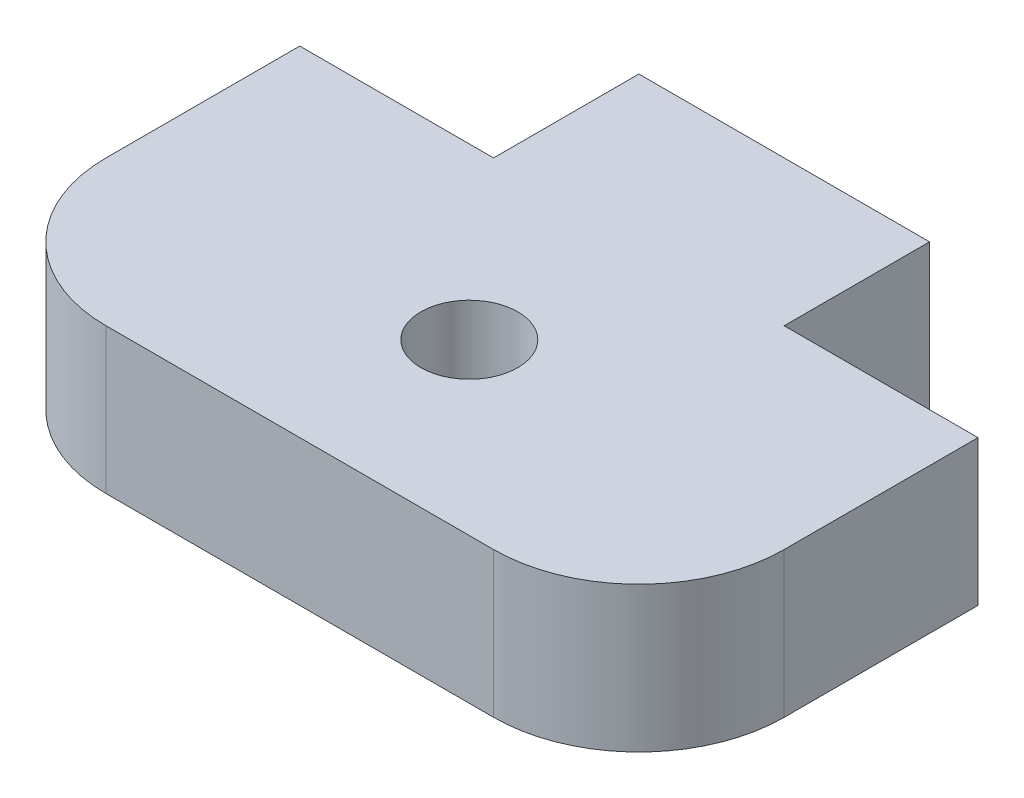
ISO-10303-21;
HEADER;
FILE_DESCRIPTION(('STEP AP214'),'2;1');
FILE_NAME('part.step','',(''),(''),'','','');
FILE_SCHEMA(('AUTOMOTIVE_DESIGN { 1 0 10303 214 1 1 1 1 }'));
ENDSEC;
DATA;
#1=APPLICATION_CONTEXT('core data for automotive mechanical design processes');
#2=APPLICATION_PROTOCOL_DEFINITION('international standard','automotive_design',2000,#1);
#3=PRODUCT_CONTEXT('',#1,'mechanical');
#4=PRODUCT('Part','Part','',(#3));
#5=PRODUCT_RELATED_PRODUCT_CATEGORY('part','',(#4));
#6=PRODUCT_DEFINITION_FORMATION('','',#4);
#7=PRODUCT_DEFINITION_CONTEXT('part definition',#1,'design');
#8=PRODUCT_DEFINITION('design','',#6,#7);
#9=PRODUCT_DEFINITION_SHAPE('','',#8);
#10=(LENGTH_UNIT() NAMED_UNIT(*) SI_UNIT(.MILLI.,.METRE.));
#11=(NAMED_UNIT(*) PLANE_ANGLE_UNIT() SI_UNIT($,.RADIAN.));
#12=(NAMED_UNIT(*) SI_UNIT($,.STERADIAN.) SOLID_ANGLE_UNIT());
#13=UNCERTAINTY_MEASURE_WITH_UNIT(LENGTH_MEASURE(1.E-05),#10,'distance_accuracy_value','');
#14=(GEOMETRIC_REPRESENTATION_CONTEXT(3) GLOBAL_UNCERTAINTY_ASSIGNED_CONTEXT((#13)) GLOBAL_UNIT_ASSIGNED_CONTEXT((#10,
#11,#12)) REPRESENTATION_CONTEXT('',''));
#15=CARTESIAN_POINT('',(0.,0.,0.));
#16=DIRECTION('',(0.,0.,1.));
#17=DIRECTION('',(1.,0.,0.));
#18=AXIS2_PLACEMENT_3D('',#15,#16,#17);
#19=CARTESIAN_POINT('',(-4.,3.,-3.));
#20=DIRECTION('',(0.,-1.,0.));
#21=DIRECTION('',(0.,0.,-1.));
#22=AXIS2_PLACEMENT_3D('',#19,#20,#21);
#23=PLANE('',#22);
#24=DIRECTION('',(0.,0.,1.));
#25=VECTOR('',#24,1.);
#26=CARTESIAN_POINT('',(-7.,3.,-7.));
#27=LINE('',#26,#25);
#28=CARTESIAN_POINT('',(-7.,3.,-7.));
#29=VERTEX_POINT('',#28);
#30=CARTESIAN_POINT('',(-7.,3.,-3.));
#31=VERTEX_POINT('',#30);
#32=EDGE_CURVE('E161',#29,#31,#27,.T.);
#33=ORIENTED_EDGE('',*,*,#32,.T.);
#34=CARTESIAN_POINT('',(-4.,3.,-3.));
#35=DIRECTION('',(0.,1.,0.));
#36=DIRECTION('',(0.,0.,-1.));
#37=AXIS2_PLACEMENT_3D('',#34,#35,#36);
#38=CIRCLE('',#37,3.);
#39=CARTESIAN_POINT('',(-4.,3.,0.));
#40=VERTEX_POINT('',#39);
#41=EDGE_CURVE('E99',#31,#40,#38,.T.);
#42=ORIENTED_EDGE('',*,*,#41,.T.);
#43=DIRECTION('',(1.,0.,0.));
#44=VECTOR('',#43,1.);
#45=CARTESIAN_POINT('',(4.,3.,0.));
#46=LINE('',#45,#44);
#47=CARTESIAN_POINT('',(4.,3.,0.));
#48=VERTEX_POINT('',#47);
#49=EDGE_CURVE('E182',#40,#48,#46,.T.);
#50=ORIENTED_EDGE('',*,*,#49,.T.);
#51=CARTESIAN_POINT('',(4.,3.,-3.));
#52=DIRECTION('',(0.,1.,0.));
#53=DIRECTION('',(0.,0.,-1.));
#54=AXIS2_PLACEMENT_3D('',#51,#52,#53);
#55=CIRCLE('',#54,3.);
#56=CARTESIAN_POINT('',(7.,3.,-3.));
#57=VERTEX_POINT('',#56);
#58=EDGE_CURVE('E201',#48,#57,#55,.T.);
#59=ORIENTED_EDGE('',*,*,#58,.T.);
#60=DIRECTION('',(0.,0.,-1.));
#61=VECTOR('',#60,1.);
#62=CARTESIAN_POINT('',(7.,3.,-7.));
#63=LINE('',#62,#61);
#64=CARTESIAN_POINT('',(7.,3.,-7.));
#65=VERTEX_POINT('',#64);
#66=EDGE_CURVE('E198',#57,#65,#63,.T.);
#67=ORIENTED_EDGE('',*,*,#66,.T.);
#68=DIRECTION('',(-1.,0.,0.));
#69=VECTOR('',#68,1.);
#70=CARTESIAN_POINT('',(3.00000000000001,3.,-7.));
#71=LINE('',#70,#69);
#72=CARTESIAN_POINT('',(3.00000000000001,3.,-7.));
#73=VERTEX_POINT('',#72);
#74=EDGE_CURVE('E200',#65,#73,#71,.T.);
#75=ORIENTED_EDGE('',*,*,#74,.T.);
#76=DIRECTION('',(0.,0.,-1.));
#77=VECTOR('',#76,1.);
#78=CARTESIAN_POINT('',(3.,3.,-10.));
#79=LINE('',#78,#77);
#80=CARTESIAN_POINT('',(3.,3.,-10.));
#81=VERTEX_POINT('',#80);
#82=EDGE_CURVE('E124',#73,#81,#79,.T.);
#83=ORIENTED_EDGE('',*,*,#82,.T.);
#84=DIRECTION('',(-1.,0.,0.));
#85=VECTOR('',#84,1.);
#86=CARTESIAN_POINT('',(3.,3.,-10.));
#87=LINE('',#86,#85);
#88=CARTESIAN_POINT('',(-3.,3.,-10.));
#89=VERTEX_POINT('',#88);
#90=EDGE_CURVE('E118',#81,#89,#87,.T.);
#91=ORIENTED_EDGE('',*,*,#90,.T.);
#92=DIRECTION('',(0.,0.,1.));
#93=VECTOR('',#92,1.);
#94=CARTESIAN_POINT('',(-3.,3.,-7.));
#95=LINE('',#94,#93);
#96=CARTESIAN_POINT('',(-3.,3.,-7.));
#97=VERTEX_POINT('',#96);
#98=EDGE_CURVE('E122',#89,#97,#95,.T.);
#99=ORIENTED_EDGE('',*,*,#98,.T.);
#100=DIRECTION('',(-1.,0.,0.));
#101=VECTOR('',#100,1.);
#102=CARTESIAN_POINT('',(-7.,3.,-7.));
#103=LINE('',#102,#101);
#104=EDGE_CURVE('E50',#97,#29,#103,.T.);
#105=ORIENTED_EDGE('',*,*,#104,.T.);
#106=EDGE_LOOP('',(#33,#42,#50,#59,#67,#75,#83,#91,#99,#105));
#107=FACE_BOUND('',#106,.T.);
#108=CARTESIAN_POINT('',(0.,3.,-3.5));
#109=DIRECTION('',(0.,1.,0.));
#110=DIRECTION('',(0.,0.,1.));
#111=AXIS2_PLACEMENT_3D('',#108,#109,#110);
#112=CIRCLE('',#111,1.);
#113=CARTESIAN_POINT('',(0.,3.,-2.5));
#114=VERTEX_POINT('',#113);
#115=EDGE_CURVE('E146',#114,#114,#112,.T.);
#116=ORIENTED_EDGE('',*,*,#115,.F.);
#117=EDGE_LOOP('',(#116));
#118=FACE_BOUND('',#117,.T.);
#119=ADVANCED_FACE('F33',(#107,#118),#23,.F.);
#120=CARTESIAN_POINT('',(-4.,0.,-3.));
#121=DIRECTION('',(0.,-1.,0.));
#122=DIRECTION('',(0.,0.,-1.));
#123=AXIS2_PLACEMENT_3D('',#120,#121,#122);
#124=PLANE('',#123);
#125=DIRECTION('',(0.,0.,1.));
#126=VECTOR('',#125,1.);
#127=CARTESIAN_POINT('',(-7.,0.,-7.));
#128=LINE('',#127,#126);
#129=CARTESIAN_POINT('',(-7.,0.,-7.));
#130=VERTEX_POINT('',#129);
#131=CARTESIAN_POINT('',(-7.,0.,-3.));
#132=VERTEX_POINT('',#131);
#133=EDGE_CURVE('E142',#130,#132,#128,.T.);
#134=ORIENTED_EDGE('',*,*,#133,.F.);
#135=DIRECTION('',(-1.,0.,0.));
#136=VECTOR('',#135,1.);
#137=CARTESIAN_POINT('',(-7.,0.,-7.));
#138=LINE('',#137,#136);
#139=CARTESIAN_POINT('',(-3.,0.,-7.));
#140=VERTEX_POINT('',#139);
#141=EDGE_CURVE('E91',#140,#130,#138,.T.);
#142=ORIENTED_EDGE('',*,*,#141,.F.);
#143=DIRECTION('',(0.,0.,1.));
#144=VECTOR('',#143,1.);
#145=CARTESIAN_POINT('',(-3.,0.,-7.));
#146=LINE('',#145,#144);
#147=CARTESIAN_POINT('',(-3.,0.,-10.));
#148=VERTEX_POINT('',#147);
#149=EDGE_CURVE('E85',#148,#140,#146,.T.);
#150=ORIENTED_EDGE('',*,*,#149,.F.);
#151=DIRECTION('',(-1.,0.,0.));
#152=VECTOR('',#151,1.);
#153=CARTESIAN_POINT('',(3.,0.,-10.));
#154=LINE('',#153,#152);
#155=CARTESIAN_POINT('',(3.,0.,-10.));
#156=VERTEX_POINT('',#155);
#157=EDGE_CURVE('E132',#156,#148,#154,.T.);
#158=ORIENTED_EDGE('',*,*,#157,.F.);
#159=DIRECTION('',(0.,0.,-1.));
#160=VECTOR('',#159,1.);
#161=CARTESIAN_POINT('',(3.,0.,-10.));
#162=LINE('',#161,#160);
#163=CARTESIAN_POINT('',(3.00000000000001,0.,-7.));
#164=VERTEX_POINT('',#163);
#165=EDGE_CURVE('E156',#164,#156,#162,.T.);
#166=ORIENTED_EDGE('',*,*,#165,.F.);
#167=DIRECTION('',(-1.,0.,0.));
#168=VECTOR('',#167,1.);
#169=CARTESIAN_POINT('',(3.00000000000001,0.,-7.));
#170=LINE('',#169,#168);
#171=CARTESIAN_POINT('',(7.,0.,-7.));
#172=VERTEX_POINT('',#171);
#173=EDGE_CURVE('E154',#172,#164,#170,.T.);
#174=ORIENTED_EDGE('',*,*,#173,.F.);
#175=DIRECTION('',(0.,0.,-1.));
#176=VECTOR('',#175,1.);
#177=CARTESIAN_POINT('',(7.,0.,-7.));
#178=LINE('',#177,#176);
#179=CARTESIAN_POINT('',(7.,0.,-3.));
#180=VERTEX_POINT('',#179);
#181=EDGE_CURVE('E152',#180,#172,#178,.T.);
#182=ORIENTED_EDGE('',*,*,#181,.F.);
#183=CARTESIAN_POINT('',(4.,0.,-3.));
#184=DIRECTION('',(0.,1.,0.));
#185=DIRECTION('',(0.,0.,-1.));
#186=AXIS2_PLACEMENT_3D('',#183,#184,#185);
#187=CIRCLE('',#186,3.);
#188=CARTESIAN_POINT('',(4.,0.,0.));
#189=VERTEX_POINT('',#188);
#190=EDGE_CURVE('E150',#189,#180,#187,.T.);
#191=ORIENTED_EDGE('',*,*,#190,.F.);
#192=DIRECTION('',(1.,0.,0.));
#193=VECTOR('',#192,1.);
#194=CARTESIAN_POINT('',(4.,0.,0.));
#195=LINE('',#194,#193);
#196=CARTESIAN_POINT('',(-4.,0.,0.));
#197=VERTEX_POINT('',#196);
#198=EDGE_CURVE('E148',#197,#189,#195,.T.);
#199=ORIENTED_EDGE('',*,*,#198,.F.);
#200=CARTESIAN_POINT('',(-4.,0.,-3.));
#201=DIRECTION('',(0.,1.,0.));
#202=DIRECTION('',(0.,0.,-1.));
#203=AXIS2_PLACEMENT_3D('',#200,#201,#202);
#204=CIRCLE('',#203,3.);
#205=EDGE_CURVE('E145',#132,#197,#204,.T.);
#206=ORIENTED_EDGE('',*,*,#205,.F.);
#207=EDGE_LOOP('',(#134,#142,#150,#158,#166,#174,#182,#191,#199,#206));
#208=FACE_BOUND('',#207,.T.);
#209=CARTESIAN_POINT('',(0.,0.,-3.5));
#210=DIRECTION('',(0.,1.,0.));
#211=DIRECTION('',(0.,0.,1.));
#212=AXIS2_PLACEMENT_3D('',#209,#210,#211);
#213=CIRCLE('',#212,1.);
#214=CARTESIAN_POINT('',(0.,0.,-2.5));
#215=VERTEX_POINT('',#214);
#216=EDGE_CURVE('E209',#215,#215,#213,.T.);
#217=ORIENTED_EDGE('',*,*,#216,.T.);
#218=EDGE_LOOP('',(#217));
#219=FACE_BOUND('',#218,.T.);
#220=ADVANCED_FACE('F186',(#208,#219),#124,.T.);
#221=CARTESIAN_POINT('',(-7.,3.,-7.));
#222=DIRECTION('',(1.,0.,0.));
#223=DIRECTION('',(0.,0.,-1.));
#224=AXIS2_PLACEMENT_3D('',#221,#222,#223);
#225=PLANE('',#224);
#226=ORIENTED_EDGE('',*,*,#133,.T.);
#227=DIRECTION('',(0.,-1.,0.));
#228=VECTOR('',#227,1.);
#229=CARTESIAN_POINT('',(-7.,3.,-3.));
#230=LINE('',#229,#228);
#231=EDGE_CURVE('E11',#31,#132,#230,.T.);
#232=ORIENTED_EDGE('',*,*,#231,.F.);
#233=ORIENTED_EDGE('',*,*,#32,.F.);
#234=DIRECTION('',(0.,-1.,0.));
#235=VECTOR('',#234,1.);
#236=CARTESIAN_POINT('',(-7.,3.,-7.));
#237=LINE('',#236,#235);
#238=EDGE_CURVE('E138',#29,#130,#237,.T.);
#239=ORIENTED_EDGE('',*,*,#238,.T.);
#240=EDGE_LOOP('',(#226,#232,#233,#239));
#241=FACE_BOUND('',#240,.T.);
#242=ADVANCED_FACE('F35',(#241),#225,.F.);
#243=CARTESIAN_POINT('',(-4.,3.,-3.));
#244=DIRECTION('',(0.,-1.,0.));
#245=DIRECTION('',(0.,0.,-1.));
#246=AXIS2_PLACEMENT_3D('',#243,#244,#245);
#247=CYLINDRICAL_SURFACE('',#246,3.);
#248=ORIENTED_EDGE('',*,*,#205,.T.);
#249=DIRECTION('',(0.,-1.,0.));
#250=VECTOR('',#249,1.);
#251=CARTESIAN_POINT('',(-4.,3.,0.));
#252=LINE('',#251,#250);
#253=EDGE_CURVE('E42',#40,#197,#252,.T.);
#254=ORIENTED_EDGE('',*,*,#253,.F.);
#255=ORIENTED_EDGE('',*,*,#41,.F.);
#256=ORIENTED_EDGE('',*,*,#231,.T.);
#257=EDGE_LOOP('',(#248,#254,#255,#256));
#258=FACE_BOUND('',#257,.T.);
#259=ADVANCED_FACE('F245',(#258),#247,.T.);
#260=CARTESIAN_POINT('',(4.,3.,0.));
#261=DIRECTION('',(0.,0.,-1.));
#262=DIRECTION('',(-1.,0.,0.));
#263=AXIS2_PLACEMENT_3D('',#260,#261,#262);
#264=PLANE('',#263);
#265=ORIENTED_EDGE('',*,*,#198,.T.);
#266=DIRECTION('',(0.,-1.,0.));
#267=VECTOR('',#266,1.);
#268=CARTESIAN_POINT('',(4.,3.,0.));
#269=LINE('',#268,#267);
#270=EDGE_CURVE('E174',#48,#189,#269,.T.);
#271=ORIENTED_EDGE('',*,*,#270,.F.);
#272=ORIENTED_EDGE('',*,*,#49,.F.);
#273=ORIENTED_EDGE('',*,*,#253,.T.);
#274=EDGE_LOOP('',(#265,#271,#272,#273));
#275=FACE_BOUND('',#274,.T.);
#276=ADVANCED_FACE('F180',(#275),#264,.F.);
#277=CARTESIAN_POINT('',(4.,3.,-3.));
#278=DIRECTION('',(0.,-1.,0.));
#279=DIRECTION('',(0.,0.,-1.));
#280=AXIS2_PLACEMENT_3D('',#277,#278,#279);
#281=CYLINDRICAL_SURFACE('',#280,3.);
#282=ORIENTED_EDGE('',*,*,#190,.T.);
#283=DIRECTION('',(0.,-1.,0.));
#284=VECTOR('',#283,1.);
#285=CARTESIAN_POINT('',(7.,3.,-3.));
#286=LINE('',#285,#284);
#287=EDGE_CURVE('E171',#57,#180,#286,.T.);
#288=ORIENTED_EDGE('',*,*,#287,.F.);
#289=ORIENTED_EDGE('',*,*,#58,.F.);
#290=ORIENTED_EDGE('',*,*,#270,.T.);
#291=EDGE_LOOP('',(#282,#288,#289,#290));
#292=FACE_BOUND('',#291,.T.);
#293=ADVANCED_FACE('F192',(#292),#281,.T.);
#294=CARTESIAN_POINT('',(7.,3.,-7.));
#295=DIRECTION('',(-1.,0.,0.));
#296=DIRECTION('',(0.,0.,1.));
#297=AXIS2_PLACEMENT_3D('',#294,#295,#296);
#298=PLANE('',#297);
#299=ORIENTED_EDGE('',*,*,#181,.T.);
#300=DIRECTION('',(0.,-1.,0.));
#301=VECTOR('',#300,1.);
#302=CARTESIAN_POINT('',(7.,3.,-7.));
#303=LINE('',#302,#301);
#304=EDGE_CURVE('E168',#65,#172,#303,.T.);
#305=ORIENTED_EDGE('',*,*,#304,.F.);
#306=ORIENTED_EDGE('',*,*,#66,.F.);
#307=ORIENTED_EDGE('',*,*,#287,.T.);
#308=EDGE_LOOP('',(#299,#305,#306,#307));
#309=FACE_BOUND('',#308,.T.);
#310=ADVANCED_FACE('F196',(#309),#298,.F.);
#311=CARTESIAN_POINT('',(3.00000000000001,3.,-7.));
#312=DIRECTION('',(0.,0.,1.));
#313=DIRECTION('',(1.,0.,0.));
#314=AXIS2_PLACEMENT_3D('',#311,#312,#313);
#315=PLANE('',#314);
#316=ORIENTED_EDGE('',*,*,#173,.T.);
#317=DIRECTION('',(0.,-1.,0.));
#318=VECTOR('',#317,1.);
#319=CARTESIAN_POINT('',(3.00000000000001,3.,-7.));
#320=LINE('',#319,#318);
#321=EDGE_CURVE('E165',#73,#164,#320,.T.);
#322=ORIENTED_EDGE('',*,*,#321,.F.);
#323=ORIENTED_EDGE('',*,*,#74,.F.);
#324=ORIENTED_EDGE('',*,*,#304,.T.);
#325=EDGE_LOOP('',(#316,#322,#323,#324));
#326=FACE_BOUND('',#325,.T.);
#327=ADVANCED_FACE('F235',(#326),#315,.F.);
#328=CARTESIAN_POINT('',(3.,3.,-10.));
#329=DIRECTION('',(-1.,0.,0.));
#330=DIRECTION('',(0.,0.,1.));
#331=AXIS2_PLACEMENT_3D('',#328,#329,#330);
#332=PLANE('',#331);
#333=ORIENTED_EDGE('',*,*,#165,.T.);
#334=DIRECTION('',(0.,-1.,0.));
#335=VECTOR('',#334,1.);
#336=CARTESIAN_POINT('',(3.,3.,-10.));
#337=LINE('',#336,#335);
#338=EDGE_CURVE('E133',#81,#156,#337,.T.);
#339=ORIENTED_EDGE('',*,*,#338,.F.);
#340=ORIENTED_EDGE('',*,*,#82,.F.);
#341=ORIENTED_EDGE('',*,*,#321,.T.);
#342=EDGE_LOOP('',(#333,#339,#340,#341));
#343=FACE_BOUND('',#342,.T.);
#344=ADVANCED_FACE('F232',(#343),#332,.F.);
#345=CARTESIAN_POINT('',(3.,3.,-10.));
#346=DIRECTION('',(0.,0.,1.));
#347=DIRECTION('',(1.,0.,0.));
#348=AXIS2_PLACEMENT_3D('',#345,#346,#347);
#349=PLANE('',#348);
#350=ORIENTED_EDGE('',*,*,#157,.T.);
#351=DIRECTION('',(0.,-1.,0.));
#352=VECTOR('',#351,1.);
#353=CARTESIAN_POINT('',(-3.,3.,-10.));
#354=LINE('',#353,#352);
#355=EDGE_CURVE('E129',#89,#148,#354,.T.);
#356=ORIENTED_EDGE('',*,*,#355,.F.);
#357=ORIENTED_EDGE('',*,*,#90,.F.);
#358=ORIENTED_EDGE('',*,*,#338,.T.);
#359=EDGE_LOOP('',(#350,#356,#357,#358));
#360=FACE_BOUND('',#359,.T.);
#361=ADVANCED_FACE('F130',(#360),#349,.F.);
#362=CARTESIAN_POINT('',(-3.,3.,-7.));
#363=DIRECTION('',(1.,0.,0.));
#364=DIRECTION('',(0.,0.,-1.));
#365=AXIS2_PLACEMENT_3D('',#362,#363,#364);
#366=PLANE('',#365);
#367=ORIENTED_EDGE('',*,*,#149,.T.);
#368=DIRECTION('',(0.,-1.,0.));
#369=VECTOR('',#368,1.);
#370=CARTESIAN_POINT('',(-3.,3.,-7.));
#371=LINE('',#370,#369);
#372=EDGE_CURVE('E134',#97,#140,#371,.T.);
#373=ORIENTED_EDGE('',*,*,#372,.F.);
#374=ORIENTED_EDGE('',*,*,#98,.F.);
#375=ORIENTED_EDGE('',*,*,#355,.T.);
#376=EDGE_LOOP('',(#367,#373,#374,#375));
#377=FACE_BOUND('',#376,.T.);
#378=ADVANCED_FACE('F136',(#377),#366,.F.);
#379=CARTESIAN_POINT('',(-7.,3.,-7.));
#380=DIRECTION('',(0.,0.,1.));
#381=DIRECTION('',(1.,0.,0.));
#382=AXIS2_PLACEMENT_3D('',#379,#380,#381);
#383=PLANE('',#382);
#384=ORIENTED_EDGE('',*,*,#141,.T.);
#385=ORIENTED_EDGE('',*,*,#238,.F.);
#386=ORIENTED_EDGE('',*,*,#104,.F.);
#387=ORIENTED_EDGE('',*,*,#372,.T.);
#388=EDGE_LOOP('',(#384,#385,#386,#387));
#389=FACE_BOUND('',#388,.T.);
#390=ADVANCED_FACE('F225',(#389),#383,.F.);
#391=CARTESIAN_POINT('',(0.,3.,-3.5));
#392=DIRECTION('',(0.,-1.,0.));
#393=DIRECTION('',(0.,0.,-1.));
#394=AXIS2_PLACEMENT_3D('',#391,#392,#393);
#395=CYLINDRICAL_SURFACE('',#394,1.);
#396=ORIENTED_EDGE('',*,*,#115,.T.);
#397=EDGE_LOOP('',(#396));
#398=FACE_BOUND('',#397,.T.);
#399=ORIENTED_EDGE('',*,*,#216,.F.);
#400=EDGE_LOOP('',(#399));
#401=FACE_BOUND('',#400,.T.);
#402=ADVANCED_FACE('F215',(#398,#401),#395,.F.);
#403=CLOSED_SHELL('',(#119,#220,#242,#259,#276,#293,#310,#327,#344,#361,#378,#390,#402));
#404=MANIFOLD_SOLID_BREP('B2',#403);
#405=ADVANCED_BREP_SHAPE_REPRESENTATION('',(#18,#404),#14);
#406=SHAPE_DEFINITION_REPRESENTATION(#9,#405);
ENDSEC;
END-ISO-10303-21;
